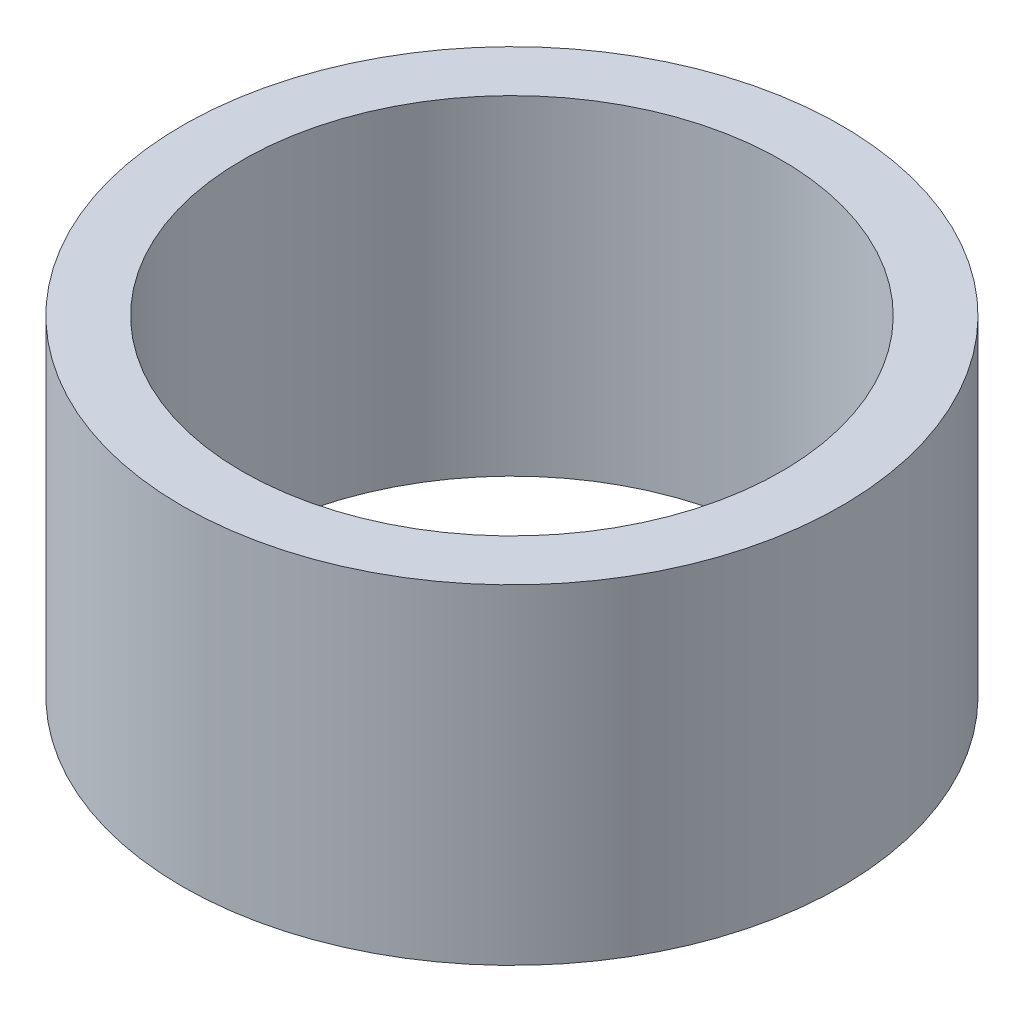
ISO-10303-21;
HEADER;
FILE_DESCRIPTION(('STEP AP214'),'2;1');
FILE_NAME('part.step','',(''),(''),'','','');
FILE_SCHEMA(('AUTOMOTIVE_DESIGN { 1 0 10303 214 1 1 1 1 }'));
ENDSEC;
DATA;
#1=APPLICATION_CONTEXT('core data for automotive mechanical design processes');
#2=APPLICATION_PROTOCOL_DEFINITION('international standard','automotive_design',2000,#1);
#3=PRODUCT_CONTEXT('',#1,'mechanical');
#4=PRODUCT('Part','Part','',(#3));
#5=PRODUCT_RELATED_PRODUCT_CATEGORY('part','',(#4));
#6=PRODUCT_DEFINITION_FORMATION('','',#4);
#7=PRODUCT_DEFINITION_CONTEXT('part definition',#1,'design');
#8=PRODUCT_DEFINITION('design','',#6,#7);
#9=PRODUCT_DEFINITION_SHAPE('','',#8);
#10=(LENGTH_UNIT() NAMED_UNIT(*) SI_UNIT(.MILLI.,.METRE.));
#11=(NAMED_UNIT(*) PLANE_ANGLE_UNIT() SI_UNIT($,.RADIAN.));
#12=(NAMED_UNIT(*) SI_UNIT($,.STERADIAN.) SOLID_ANGLE_UNIT());
#13=UNCERTAINTY_MEASURE_WITH_UNIT(LENGTH_MEASURE(1.E-05),#10,'distance_accuracy_value','');
#14=(GEOMETRIC_REPRESENTATION_CONTEXT(3) GLOBAL_UNCERTAINTY_ASSIGNED_CONTEXT((#13)) GLOBAL_UNIT_ASSIGNED_CONTEXT((#10,
#11,#12)) REPRESENTATION_CONTEXT('',''));
#15=CARTESIAN_POINT('',(0.,0.,0.));
#16=DIRECTION('',(0.,0.,1.));
#17=DIRECTION('',(1.,0.,0.));
#18=AXIS2_PLACEMENT_3D('',#15,#16,#17);
#19=CARTESIAN_POINT('',(0.,11.,0.));
#20=DIRECTION('',(0.,1.,0.));
#21=DIRECTION('',(0.,0.,1.));
#22=AXIS2_PLACEMENT_3D('',#19,#20,#21);
#23=PLANE('',#22);
#24=CARTESIAN_POINT('',(0.,11.,0.));
#25=DIRECTION('',(0.,1.,0.));
#26=DIRECTION('',(0.,0.,1.));
#27=AXIS2_PLACEMENT_3D('',#24,#25,#26);
#28=CIRCLE('',#27,11.);
#29=CARTESIAN_POINT('',(0.,11.,11.));
#30=VERTEX_POINT('',#29);
#31=EDGE_CURVE('E10',#30,#30,#28,.T.);
#32=ORIENTED_EDGE('',*,*,#31,.T.);
#33=EDGE_LOOP('',(#32));
#34=FACE_BOUND('',#33,.T.);
#35=CARTESIAN_POINT('',(0.,11.,0.));
#36=DIRECTION('',(0.,1.,0.));
#37=DIRECTION('',(0.,0.,1.));
#38=AXIS2_PLACEMENT_3D('',#35,#36,#37);
#39=CIRCLE('',#38,9.);
#40=CARTESIAN_POINT('',(0.,11.,9.00000000000001));
#41=VERTEX_POINT('',#40);
#42=EDGE_CURVE('E42',#41,#41,#39,.T.);
#43=ORIENTED_EDGE('',*,*,#42,.F.);
#44=EDGE_LOOP('',(#43));
#45=FACE_BOUND('',#44,.T.);
#46=ADVANCED_FACE('F31',(#34,#45),#23,.T.);
#47=CARTESIAN_POINT('',(0.,0.,0.));
#48=DIRECTION('',(0.,1.,0.));
#49=DIRECTION('',(0.,0.,1.));
#50=AXIS2_PLACEMENT_3D('',#47,#48,#49);
#51=PLANE('',#50);
#52=CARTESIAN_POINT('',(0.,0.,0.));
#53=DIRECTION('',(0.,1.,0.));
#54=DIRECTION('',(0.,0.,1.));
#55=AXIS2_PLACEMENT_3D('',#52,#53,#54);
#56=CIRCLE('',#55,11.);
#57=CARTESIAN_POINT('',(0.,0.,11.));
#58=VERTEX_POINT('',#57);
#59=EDGE_CURVE('E35',#58,#58,#56,.T.);
#60=ORIENTED_EDGE('',*,*,#59,.F.);
#61=EDGE_LOOP('',(#60));
#62=FACE_BOUND('',#61,.T.);
#63=CARTESIAN_POINT('',(0.,0.,0.));
#64=DIRECTION('',(0.,1.,0.));
#65=DIRECTION('',(0.,0.,1.));
#66=AXIS2_PLACEMENT_3D('',#63,#64,#65);
#67=CIRCLE('',#66,9.);
#68=CARTESIAN_POINT('',(0.,0.,9.00000000000001));
#69=VERTEX_POINT('',#68);
#70=EDGE_CURVE('E44',#69,#69,#67,.T.);
#71=ORIENTED_EDGE('',*,*,#70,.T.);
#72=EDGE_LOOP('',(#71));
#73=FACE_BOUND('',#72,.T.);
#74=ADVANCED_FACE('F54',(#62,#73),#51,.F.);
#75=CARTESIAN_POINT('',(0.,11.,0.));
#76=DIRECTION('',(0.,-1.,0.));
#77=DIRECTION('',(0.,0.,-1.));
#78=AXIS2_PLACEMENT_3D('',#75,#76,#77);
#79=CYLINDRICAL_SURFACE('',#78,11.);
#80=ORIENTED_EDGE('',*,*,#31,.F.);
#81=EDGE_LOOP('',(#80));
#82=FACE_BOUND('',#81,.T.);
#83=ORIENTED_EDGE('',*,*,#59,.T.);
#84=EDGE_LOOP('',(#83));
#85=FACE_BOUND('',#84,.T.);
#86=ADVANCED_FACE('F33',(#82,#85),#79,.T.);
#87=CARTESIAN_POINT('',(0.,11.,0.));
#88=DIRECTION('',(0.,-1.,0.));
#89=DIRECTION('',(0.,0.,-1.));
#90=AXIS2_PLACEMENT_3D('',#87,#88,#89);
#91=CYLINDRICAL_SURFACE('',#90,9.);
#92=ORIENTED_EDGE('',*,*,#42,.T.);
#93=EDGE_LOOP('',(#92));
#94=FACE_BOUND('',#93,.T.);
#95=ORIENTED_EDGE('',*,*,#70,.F.);
#96=EDGE_LOOP('',(#95));
#97=FACE_BOUND('',#96,.T.);
#98=ADVANCED_FACE('F50',(#94,#97),#91,.F.);
#99=CLOSED_SHELL('',(#46,#74,#86,#98));
#100=MANIFOLD_SOLID_BREP('B2',#99);
#101=ADVANCED_BREP_SHAPE_REPRESENTATION('',(#18,#100),#14);
#102=SHAPE_DEFINITION_REPRESENTATION(#9,#101);
ENDSEC;
END-ISO-10303-21;
